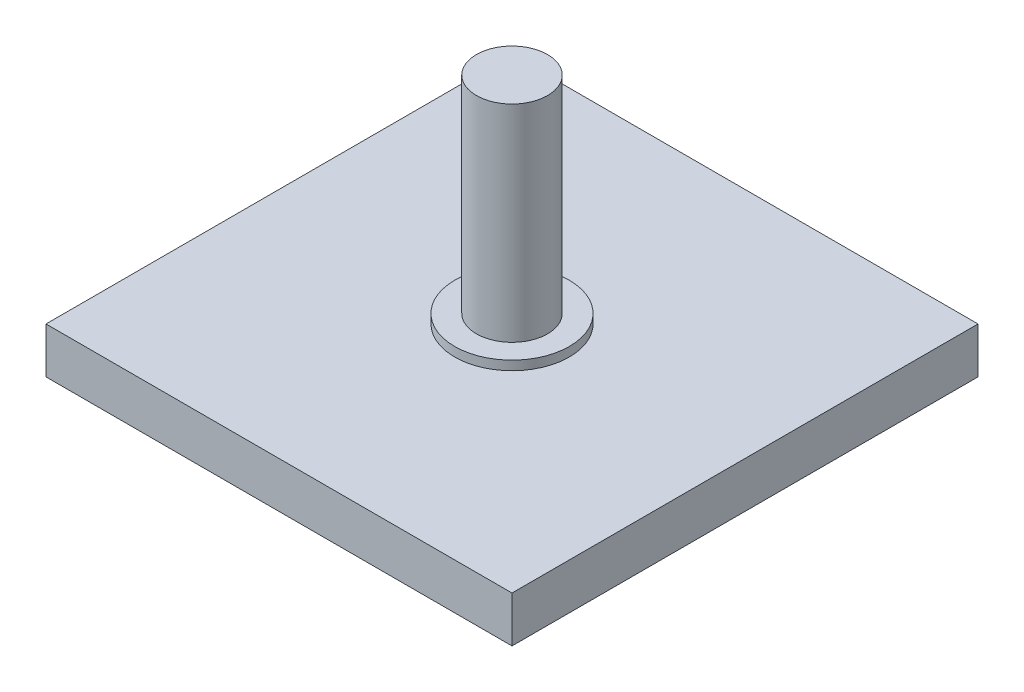
ISO-10303-21;
HEADER;
FILE_DESCRIPTION(('STEP AP214'),'2;1');
FILE_NAME('part.step','',(''),(''),'','','');
FILE_SCHEMA(('AUTOMOTIVE_DESIGN { 1 0 10303 214 1 1 1 1 }'));
ENDSEC;
DATA;
#1=APPLICATION_CONTEXT('core data for automotive mechanical design processes');
#2=APPLICATION_PROTOCOL_DEFINITION('international standard','automotive_design',2000,#1);
#3=PRODUCT_CONTEXT('',#1,'mechanical');
#4=PRODUCT('Part','Part','',(#3));
#5=PRODUCT_RELATED_PRODUCT_CATEGORY('part','',(#4));
#6=PRODUCT_DEFINITION_FORMATION('','',#4);
#7=PRODUCT_DEFINITION_CONTEXT('part definition',#1,'design');
#8=PRODUCT_DEFINITION('design','',#6,#7);
#9=PRODUCT_DEFINITION_SHAPE('','',#8);
#10=(LENGTH_UNIT() NAMED_UNIT(*) SI_UNIT(.MILLI.,.METRE.));
#11=(NAMED_UNIT(*) PLANE_ANGLE_UNIT() SI_UNIT($,.RADIAN.));
#12=(NAMED_UNIT(*) SI_UNIT($,.STERADIAN.) SOLID_ANGLE_UNIT());
#13=UNCERTAINTY_MEASURE_WITH_UNIT(LENGTH_MEASURE(1.E-05),#10,'distance_accuracy_value','');
#14=(GEOMETRIC_REPRESENTATION_CONTEXT(3) GLOBAL_UNCERTAINTY_ASSIGNED_CONTEXT((#13)) GLOBAL_UNIT_ASSIGNED_CONTEXT((#10,
#11,#12)) REPRESENTATION_CONTEXT('',''));
#15=CARTESIAN_POINT('',(0.,0.,0.));
#16=DIRECTION('',(0.,0.,1.));
#17=DIRECTION('',(1.,0.,0.));
#18=AXIS2_PLACEMENT_3D('',#15,#16,#17);
#19=CARTESIAN_POINT('',(50.8,10.,50.8));
#20=DIRECTION('',(-1.,0.,0.));
#21=DIRECTION('',(0.,0.,1.));
#22=AXIS2_PLACEMENT_3D('',#19,#20,#21);
#23=PLANE('',#22);
#24=DIRECTION('',(0.,0.,-1.));
#25=VECTOR('',#24,1.);
#26=CARTESIAN_POINT('',(50.8,0.,50.8));
#27=LINE('',#26,#25);
#28=CARTESIAN_POINT('',(50.8,0.,50.8));
#29=VERTEX_POINT('',#28);
#30=CARTESIAN_POINT('',(50.8,0.,-50.8));
#31=VERTEX_POINT('',#30);
#32=EDGE_CURVE('E99',#29,#31,#27,.T.);
#33=ORIENTED_EDGE('',*,*,#32,.T.);
#34=DIRECTION('',(0.,-1.,0.));
#35=VECTOR('',#34,1.);
#36=CARTESIAN_POINT('',(50.8,10.,-50.8));
#37=LINE('',#36,#35);
#38=CARTESIAN_POINT('',(50.8,10.,-50.8));
#39=VERTEX_POINT('',#38);
#40=EDGE_CURVE('E41',#39,#31,#37,.T.);
#41=ORIENTED_EDGE('',*,*,#40,.F.);
#42=DIRECTION('',(0.,0.,-1.));
#43=VECTOR('',#42,1.);
#44=CARTESIAN_POINT('',(50.8,10.,50.8));
#45=LINE('',#44,#43);
#46=CARTESIAN_POINT('',(50.8,10.,50.8));
#47=VERTEX_POINT('',#46);
#48=EDGE_CURVE('E85',#47,#39,#45,.T.);
#49=ORIENTED_EDGE('',*,*,#48,.F.);
#50=DIRECTION('',(0.,-1.,0.));
#51=VECTOR('',#50,1.);
#52=CARTESIAN_POINT('',(50.8,10.,50.8));
#53=LINE('',#52,#51);
#54=EDGE_CURVE('E95',#47,#29,#53,.T.);
#55=ORIENTED_EDGE('',*,*,#54,.T.);
#56=EDGE_LOOP('',(#33,#41,#49,#55));
#57=FACE_BOUND('',#56,.T.);
#58=ADVANCED_FACE('F33',(#57),#23,.F.);
#59=CARTESIAN_POINT('',(-50.8,10.,-50.8));
#60=DIRECTION('',(0.,0.,1.));
#61=DIRECTION('',(1.,0.,0.));
#62=AXIS2_PLACEMENT_3D('',#59,#60,#61);
#63=PLANE('',#62);
#64=DIRECTION('',(-1.,0.,0.));
#65=VECTOR('',#64,1.);
#66=CARTESIAN_POINT('',(-50.8,0.,-50.8));
#67=LINE('',#66,#65);
#68=CARTESIAN_POINT('',(-50.8,0.,-50.8));
#69=VERTEX_POINT('',#68);
#70=EDGE_CURVE('E90',#31,#69,#67,.T.);
#71=ORIENTED_EDGE('',*,*,#70,.T.);
#72=DIRECTION('',(0.,-1.,0.));
#73=VECTOR('',#72,1.);
#74=CARTESIAN_POINT('',(-50.8,10.,-50.8));
#75=LINE('',#74,#73);
#76=CARTESIAN_POINT('',(-50.8,10.,-50.8));
#77=VERTEX_POINT('',#76);
#78=EDGE_CURVE('E88',#77,#69,#75,.T.);
#79=ORIENTED_EDGE('',*,*,#78,.F.);
#80=DIRECTION('',(-1.,0.,0.));
#81=VECTOR('',#80,1.);
#82=CARTESIAN_POINT('',(-50.8,10.,-50.8));
#83=LINE('',#82,#81);
#84=EDGE_CURVE('E80',#39,#77,#83,.T.);
#85=ORIENTED_EDGE('',*,*,#84,.F.);
#86=ORIENTED_EDGE('',*,*,#40,.T.);
#87=EDGE_LOOP('',(#71,#79,#85,#86));
#88=FACE_BOUND('',#87,.T.);
#89=ADVANCED_FACE('F89',(#88),#63,.F.);
#90=CARTESIAN_POINT('',(-50.8,10.,50.8));
#91=DIRECTION('',(1.,0.,0.));
#92=DIRECTION('',(0.,0.,-1.));
#93=AXIS2_PLACEMENT_3D('',#90,#91,#92);
#94=PLANE('',#93);
#95=DIRECTION('',(0.,0.,1.));
#96=VECTOR('',#95,1.);
#97=CARTESIAN_POINT('',(-50.8,0.,50.8));
#98=LINE('',#97,#96);
#99=CARTESIAN_POINT('',(-50.8,0.,50.8));
#100=VERTEX_POINT('',#99);
#101=EDGE_CURVE('E66',#69,#100,#98,.T.);
#102=ORIENTED_EDGE('',*,*,#101,.T.);
#103=DIRECTION('',(0.,-1.,0.));
#104=VECTOR('',#103,1.);
#105=CARTESIAN_POINT('',(-50.8,10.,50.8));
#106=LINE('',#105,#104);
#107=CARTESIAN_POINT('',(-50.8,10.,50.8));
#108=VERTEX_POINT('',#107);
#109=EDGE_CURVE('E91',#108,#100,#106,.T.);
#110=ORIENTED_EDGE('',*,*,#109,.F.);
#111=DIRECTION('',(0.,0.,1.));
#112=VECTOR('',#111,1.);
#113=CARTESIAN_POINT('',(-50.8,10.,50.8));
#114=LINE('',#113,#112);
#115=EDGE_CURVE('E83',#77,#108,#114,.T.);
#116=ORIENTED_EDGE('',*,*,#115,.F.);
#117=ORIENTED_EDGE('',*,*,#78,.T.);
#118=EDGE_LOOP('',(#102,#110,#116,#117));
#119=FACE_BOUND('',#118,.T.);
#120=ADVANCED_FACE('F93',(#119),#94,.F.);
#121=CARTESIAN_POINT('',(-50.8,10.,50.8));
#122=DIRECTION('',(0.,0.,-1.));
#123=DIRECTION('',(-1.,0.,0.));
#124=AXIS2_PLACEMENT_3D('',#121,#122,#123);
#125=PLANE('',#124);
#126=DIRECTION('',(1.,0.,0.));
#127=VECTOR('',#126,1.);
#128=CARTESIAN_POINT('',(-50.8,0.,50.8));
#129=LINE('',#128,#127);
#130=EDGE_CURVE('E72',#100,#29,#129,.T.);
#131=ORIENTED_EDGE('',*,*,#130,.T.);
#132=ORIENTED_EDGE('',*,*,#54,.F.);
#133=DIRECTION('',(1.,0.,0.));
#134=VECTOR('',#133,1.);
#135=CARTESIAN_POINT('',(-50.8,10.,50.8));
#136=LINE('',#135,#134);
#137=EDGE_CURVE('E49',#108,#47,#136,.T.);
#138=ORIENTED_EDGE('',*,*,#137,.F.);
#139=ORIENTED_EDGE('',*,*,#109,.T.);
#140=EDGE_LOOP('',(#131,#132,#138,#139));
#141=FACE_BOUND('',#140,.T.);
#142=ADVANCED_FACE('F122',(#141),#125,.F.);
#143=CARTESIAN_POINT('',(0.,10.,0.));
#144=DIRECTION('',(0.,-1.,0.));
#145=DIRECTION('',(0.,0.,-1.));
#146=AXIS2_PLACEMENT_3D('',#143,#144,#145);
#147=PLANE('',#146);
#148=CARTESIAN_POINT('',(0.,10.,0.));
#149=DIRECTION('',(0.,-1.,0.));
#150=DIRECTION('',(0.,0.,-1.));
#151=AXIS2_PLACEMENT_3D('',#148,#149,#150);
#152=CIRCLE('',#151,12.5);
#153=CARTESIAN_POINT('',(0.,10.,-12.5));
#154=VERTEX_POINT('',#153);
#155=EDGE_CURVE('E11',#154,#154,#152,.F.);
#156=ORIENTED_EDGE('',*,*,#155,.F.);
#157=EDGE_LOOP('',(#156));
#158=FACE_BOUND('',#157,.T.);
#159=ORIENTED_EDGE('',*,*,#48,.T.);
#160=ORIENTED_EDGE('',*,*,#84,.T.);
#161=ORIENTED_EDGE('',*,*,#115,.T.);
#162=ORIENTED_EDGE('',*,*,#137,.T.);
#163=EDGE_LOOP('',(#159,#160,#161,#162));
#164=FACE_BOUND('',#163,.T.);
#165=ADVANCED_FACE('F81',(#158,#164),#147,.F.);
#166=CARTESIAN_POINT('',(0.,0.,0.));
#167=DIRECTION('',(0.,-1.,0.));
#168=DIRECTION('',(0.,0.,-1.));
#169=AXIS2_PLACEMENT_3D('',#166,#167,#168);
#170=PLANE('',#169);
#171=CARTESIAN_POINT('',(0.,0.,0.));
#172=DIRECTION('',(0.,-1.,0.));
#173=DIRECTION('',(0.,0.,-1.));
#174=AXIS2_PLACEMENT_3D('',#171,#172,#173);
#175=CIRCLE('',#174,5.);
#176=CARTESIAN_POINT('',(0.,0.,-5.));
#177=VERTEX_POINT('',#176);
#178=EDGE_CURVE('E200',#177,#177,#175,.T.);
#179=ORIENTED_EDGE('',*,*,#178,.F.);
#180=EDGE_LOOP('',(#179));
#181=FACE_BOUND('',#180,.T.);
#182=ORIENTED_EDGE('',*,*,#32,.F.);
#183=ORIENTED_EDGE('',*,*,#130,.F.);
#184=ORIENTED_EDGE('',*,*,#101,.F.);
#185=ORIENTED_EDGE('',*,*,#70,.F.);
#186=EDGE_LOOP('',(#182,#183,#184,#185));
#187=FACE_BOUND('',#186,.T.);
#188=ADVANCED_FACE('F110',(#181,#187),#170,.T.);
#189=CARTESIAN_POINT('',(0.,5.,0.));
#190=DIRECTION('',(0.,-1.,0.));
#191=DIRECTION('',(0.,0.,-1.));
#192=AXIS2_PLACEMENT_3D('',#189,#190,#191);
#193=CYLINDRICAL_SURFACE('',#192,5.);
#194=CARTESIAN_POINT('',(0.,5.,0.));
#195=DIRECTION('',(0.,-1.,0.));
#196=DIRECTION('',(0.,0.,-1.));
#197=AXIS2_PLACEMENT_3D('',#194,#195,#196);
#198=CIRCLE('',#197,5.);
#199=CARTESIAN_POINT('',(0.,5.,-5.));
#200=VERTEX_POINT('',#199);
#201=EDGE_CURVE('E102',#200,#200,#198,.T.);
#202=ORIENTED_EDGE('',*,*,#201,.F.);
#203=EDGE_LOOP('',(#202));
#204=FACE_BOUND('',#203,.T.);
#205=ORIENTED_EDGE('',*,*,#178,.T.);
#206=EDGE_LOOP('',(#205));
#207=FACE_BOUND('',#206,.T.);
#208=ADVANCED_FACE('F112',(#204,#207),#193,.F.);
#209=CARTESIAN_POINT('',(0.,5.,0.));
#210=DIRECTION('',(0.,-1.,0.));
#211=DIRECTION('',(0.,0.,-1.));
#212=AXIS2_PLACEMENT_3D('',#209,#210,#211);
#213=PLANE('',#212);
#214=ORIENTED_EDGE('',*,*,#201,.T.);
#215=EDGE_LOOP('',(#214));
#216=FACE_BOUND('',#215,.T.);
#217=ADVANCED_FACE('F119',(#216),#213,.T.);
#218=CARTESIAN_POINT('',(0.,12.,0.));
#219=DIRECTION('',(0.,-1.,0.));
#220=DIRECTION('',(0.,0.,-1.));
#221=AXIS2_PLACEMENT_3D('',#218,#219,#220);
#222=CYLINDRICAL_SURFACE('',#221,12.5);
#223=CARTESIAN_POINT('',(0.,12.,0.));
#224=DIRECTION('',(0.,1.,0.));
#225=DIRECTION('',(0.,0.,1.));
#226=AXIS2_PLACEMENT_3D('',#223,#224,#225);
#227=CIRCLE('',#226,12.5);
#228=CARTESIAN_POINT('',(0.,12.,12.5));
#229=VERTEX_POINT('',#228);
#230=EDGE_CURVE('E203',#229,#229,#227,.T.);
#231=ORIENTED_EDGE('',*,*,#230,.F.);
#232=EDGE_LOOP('',(#231));
#233=FACE_BOUND('',#232,.T.);
#234=ORIENTED_EDGE('',*,*,#155,.T.);
#235=EDGE_LOOP('',(#234));
#236=FACE_BOUND('',#235,.T.);
#237=ADVANCED_FACE('F155',(#233,#236),#222,.T.);
#238=CARTESIAN_POINT('',(0.,12.,0.));
#239=DIRECTION('',(0.,1.,0.));
#240=DIRECTION('',(0.,0.,1.));
#241=AXIS2_PLACEMENT_3D('',#238,#239,#240);
#242=PLANE('',#241);
#243=CARTESIAN_POINT('',(0.,12.,0.));
#244=DIRECTION('',(0.,1.,0.));
#245=DIRECTION('',(0.,0.,1.));
#246=AXIS2_PLACEMENT_3D('',#243,#244,#245);
#247=CIRCLE('',#246,7.75);
#248=CARTESIAN_POINT('',(0.,12.,-7.75));
#249=VERTEX_POINT('',#248);
#250=EDGE_CURVE('E209',#249,#249,#247,.T.);
#251=ORIENTED_EDGE('',*,*,#250,.F.);
#252=EDGE_LOOP('',(#251));
#253=FACE_BOUND('',#252,.T.);
#254=ORIENTED_EDGE('',*,*,#230,.T.);
#255=EDGE_LOOP('',(#254));
#256=FACE_BOUND('',#255,.T.);
#257=ADVANCED_FACE('F160',(#253,#256),#242,.T.);
#258=CARTESIAN_POINT('',(0.,57.,0.));
#259=DIRECTION('',(0.,-1.,0.));
#260=DIRECTION('',(0.,0.,-1.));
#261=AXIS2_PLACEMENT_3D('',#258,#259,#260);
#262=CYLINDRICAL_SURFACE('',#261,7.75);
#263=CARTESIAN_POINT('',(0.,57.,0.));
#264=DIRECTION('',(0.,1.,0.));
#265=DIRECTION('',(0.,0.,1.));
#266=AXIS2_PLACEMENT_3D('',#263,#264,#265);
#267=CIRCLE('',#266,7.75);
#268=CARTESIAN_POINT('',(0.,57.,-7.75));
#269=VERTEX_POINT('',#268);
#270=EDGE_CURVE('E208',#269,#269,#267,.T.);
#271=CARTESIAN_POINT('',(0.,57.,-7.75));
#272=CARTESIAN_POINT('',(0.,56.53125,-7.75));
#273=CARTESIAN_POINT('',(0.,56.0625,-7.75));
#274=CARTESIAN_POINT('',(0.,55.125,-7.75));
#275=CARTESIAN_POINT('',(0.,54.65625,-7.75));
#276=CARTESIAN_POINT('',(0.,53.71875,-7.75));
#277=CARTESIAN_POINT('',(0.,53.25,-7.75));
#278=CARTESIAN_POINT('',(0.,52.3125,-7.75));
#279=CARTESIAN_POINT('',(0.,51.84375,-7.75));
#280=CARTESIAN_POINT('',(0.,50.90625,-7.75));
#281=CARTESIAN_POINT('',(0.,50.4375,-7.75));
#282=CARTESIAN_POINT('',(0.,49.5,-7.75));
#283=CARTESIAN_POINT('',(0.,49.03125,-7.75));
#284=CARTESIAN_POINT('',(0.,48.09375,-7.75));
#285=CARTESIAN_POINT('',(0.,47.625,-7.75));
#286=CARTESIAN_POINT('',(0.,46.6875,-7.75));
#287=CARTESIAN_POINT('',(0.,46.21875,-7.75));
#288=CARTESIAN_POINT('',(0.,45.28125,-7.75));
#289=CARTESIAN_POINT('',(0.,44.8125,-7.75));
#290=CARTESIAN_POINT('',(0.,43.875,-7.75));
#291=CARTESIAN_POINT('',(0.,43.40625,-7.75));
#292=CARTESIAN_POINT('',(0.,42.46875,-7.75));
#293=CARTESIAN_POINT('',(0.,42.,-7.75));
#294=CARTESIAN_POINT('',(0.,41.0625,-7.75));
#295=CARTESIAN_POINT('',(0.,40.59375,-7.75));
#296=CARTESIAN_POINT('',(0.,39.65625,-7.75));
#297=CARTESIAN_POINT('',(0.,39.1875,-7.75));
#298=CARTESIAN_POINT('',(0.,38.25,-7.75));
#299=CARTESIAN_POINT('',(0.,37.78125,-7.75));
#300=CARTESIAN_POINT('',(0.,36.84375,-7.75));
#301=CARTESIAN_POINT('',(0.,36.375,-7.75));
#302=CARTESIAN_POINT('',(0.,35.4375,-7.75));
#303=CARTESIAN_POINT('',(0.,34.96875,-7.75));
#304=CARTESIAN_POINT('',(0.,34.03125,-7.75));
#305=CARTESIAN_POINT('',(0.,33.5625,-7.75));
#306=CARTESIAN_POINT('',(0.,32.625,-7.75));
#307=CARTESIAN_POINT('',(0.,32.15625,-7.75));
#308=CARTESIAN_POINT('',(0.,31.21875,-7.75));
#309=CARTESIAN_POINT('',(0.,30.75,-7.75));
#310=CARTESIAN_POINT('',(0.,29.8125,-7.75));
#311=CARTESIAN_POINT('',(0.,29.34375,-7.75));
#312=CARTESIAN_POINT('',(0.,28.40625,-7.75));
#313=CARTESIAN_POINT('',(0.,27.9375,-7.75));
#314=CARTESIAN_POINT('',(0.,27.,-7.75));
#315=CARTESIAN_POINT('',(0.,26.53125,-7.75));
#316=CARTESIAN_POINT('',(0.,25.59375,-7.75));
#317=CARTESIAN_POINT('',(0.,25.125,-7.75));
#318=CARTESIAN_POINT('',(0.,24.1875,-7.75));
#319=CARTESIAN_POINT('',(0.,23.71875,-7.75));
#320=CARTESIAN_POINT('',(0.,22.78125,-7.75));
#321=CARTESIAN_POINT('',(0.,22.3125,-7.75));
#322=CARTESIAN_POINT('',(0.,21.375,-7.75));
#323=CARTESIAN_POINT('',(0.,20.90625,-7.75));
#324=CARTESIAN_POINT('',(0.,19.96875,-7.75));
#325=CARTESIAN_POINT('',(0.,19.5,-7.75));
#326=CARTESIAN_POINT('',(0.,18.5625,-7.75));
#327=CARTESIAN_POINT('',(0.,18.09375,-7.75));
#328=CARTESIAN_POINT('',(0.,17.15625,-7.75));
#329=CARTESIAN_POINT('',(0.,16.6875,-7.75));
#330=CARTESIAN_POINT('',(0.,15.75,-7.75));
#331=CARTESIAN_POINT('',(0.,15.28125,-7.75));
#332=CARTESIAN_POINT('',(0.,14.34375,-7.75));
#333=CARTESIAN_POINT('',(0.,13.875,-7.75));
#334=CARTESIAN_POINT('',(0.,12.9375,-7.75));
#335=CARTESIAN_POINT('',(0.,12.46875,-7.75));
#336=CARTESIAN_POINT('',(0.,12.,-7.75));
#337=B_SPLINE_CURVE_WITH_KNOTS('',3,(#271,#272,#273,#274,#275,#276,#277,#278,#279,#280,#281,
#282,#283,#284,#285,#286,#287,#288,#289,#290,#291,#292,#293,#294,#295,#296,#297,#298,#299,#300,
#301,#302,#303,#304,#305,#306,#307,#308,#309,#310,#311,#312,#313,#314,#315,#316,#317,#318,#319,
#320,#321,#322,#323,#324,#325,#326,#327,#328,#329,#330,#331,#332,#333,#334,#335,#336),
.UNSPECIFIED.,.F.,.F.,(4,2,2,2,2,2,2,2,2,2,2,2,2,2,2,2,2,2,2,2,2,2,2,2,2,2,2,2,2,2,2,2,4),(0.,
1.40625,2.8125,4.21875,5.62500000000001,7.03125,8.4375,9.84375,11.25,12.65625,14.0625,15.46875,
16.875,18.28125,19.6875,21.09375,22.5,23.90625,25.3125,26.71875,28.125,29.53125,30.9375,
32.34375,33.75,35.15625,36.5625,37.96875,39.375,40.78125,42.1875,43.59375,45.),.UNSPECIFIED.);
#338=EDGE_CURVE('BSEAM170',#269,#249,#337,.T.);
#339=ORIENTED_EDGE('',*,*,#270,.F.);
#340=ORIENTED_EDGE('',*,*,#250,.T.);
#341=ORIENTED_EDGE('',*,*,#338,.T.);
#342=ORIENTED_EDGE('',*,*,#338,.F.);
#343=EDGE_LOOP('',(#339,#341,#340,#342));
#344=FACE_BOUND('',#343,.T.);
#345=ADVANCED_FACE('F170',(#344),#262,.T.);
#346=CARTESIAN_POINT('',(0.,57.,0.));
#347=DIRECTION('',(0.,1.,0.));
#348=DIRECTION('',(0.,0.,1.));
#349=AXIS2_PLACEMENT_3D('',#346,#347,#348);
#350=PLANE('',#349);
#351=ORIENTED_EDGE('',*,*,#270,.T.);
#352=EDGE_LOOP('',(#351));
#353=FACE_BOUND('',#352,.T.);
#354=ADVANCED_FACE('F180',(#353),#350,.T.);
#355=CLOSED_SHELL('',(#58,#89,#120,#142,#165,#188,#208,#217,#237,#257,#345,#354));
#356=MANIFOLD_SOLID_BREP('B2',#355);
#357=ADVANCED_BREP_SHAPE_REPRESENTATION('',(#18,#356),#14);
#358=SHAPE_DEFINITION_REPRESENTATION(#9,#357);
ENDSEC;
END-ISO-10303-21;
